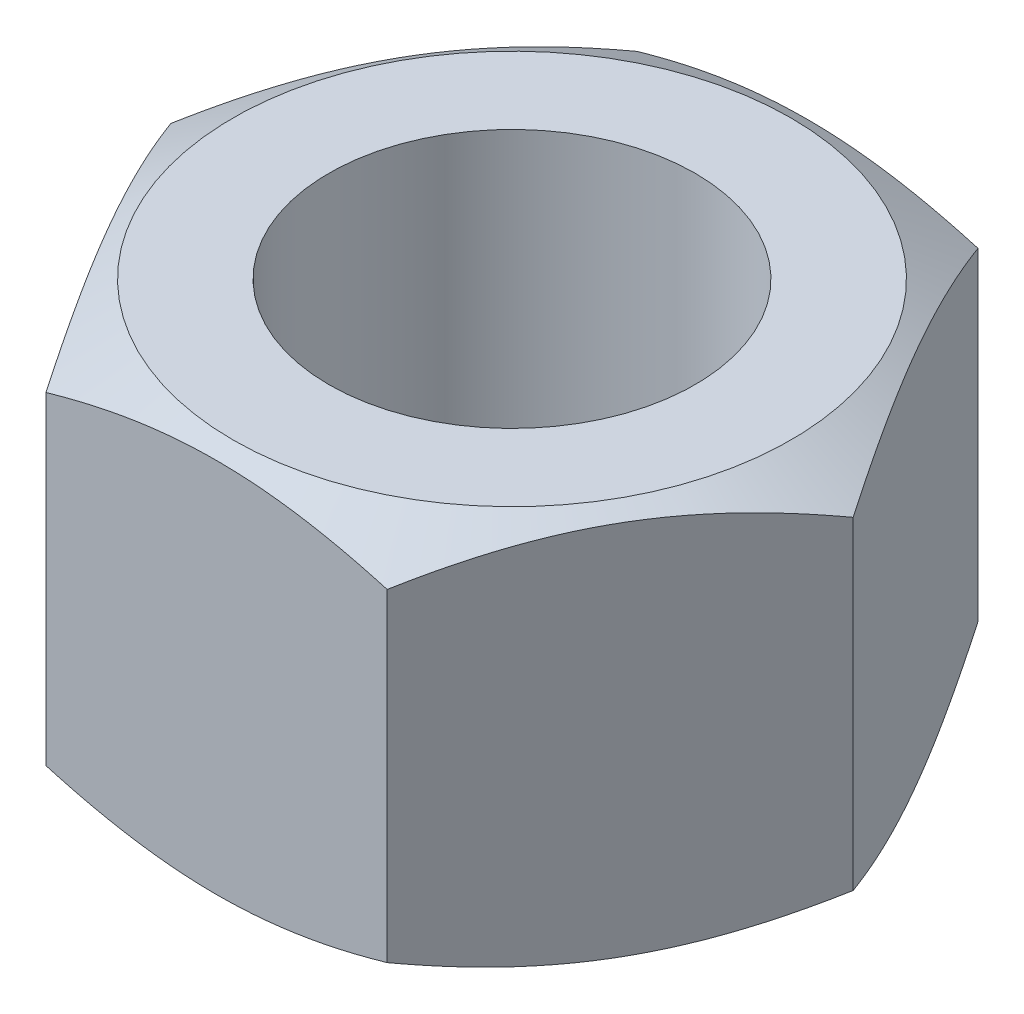
ISO-10303-21;
HEADER;
FILE_DESCRIPTION(('STEP AP214'),'2;1');
FILE_NAME('part.step','',(''),(''),'','','');
FILE_SCHEMA(('AUTOMOTIVE_DESIGN { 1 0 10303 214 1 1 1 1 }'));
ENDSEC;
DATA;
#1=APPLICATION_CONTEXT('core data for automotive mechanical design processes');
#2=APPLICATION_PROTOCOL_DEFINITION('international standard','automotive_design',2000,#1);
#3=PRODUCT_CONTEXT('',#1,'mechanical');
#4=PRODUCT('Part','Part','',(#3));
#5=PRODUCT_RELATED_PRODUCT_CATEGORY('part','',(#4));
#6=PRODUCT_DEFINITION_FORMATION('','',#4);
#7=PRODUCT_DEFINITION_CONTEXT('part definition',#1,'design');
#8=PRODUCT_DEFINITION('design','',#6,#7);
#9=PRODUCT_DEFINITION_SHAPE('','',#8);
#10=(LENGTH_UNIT() NAMED_UNIT(*) SI_UNIT(.MILLI.,.METRE.));
#11=(NAMED_UNIT(*) PLANE_ANGLE_UNIT() SI_UNIT($,.RADIAN.));
#12=(NAMED_UNIT(*) SI_UNIT($,.STERADIAN.) SOLID_ANGLE_UNIT());
#13=UNCERTAINTY_MEASURE_WITH_UNIT(LENGTH_MEASURE(1.E-05),#10,'distance_accuracy_value','');
#14=(GEOMETRIC_REPRESENTATION_CONTEXT(3) GLOBAL_UNCERTAINTY_ASSIGNED_CONTEXT((#13)) GLOBAL_UNIT_ASSIGNED_CONTEXT((#10,
#11,#12)) REPRESENTATION_CONTEXT('',''));
#15=CARTESIAN_POINT('',(0.,0.,0.));
#16=DIRECTION('',(0.,0.,1.));
#17=DIRECTION('',(1.,0.,0.));
#18=AXIS2_PLACEMENT_3D('',#15,#16,#17);
#19=CARTESIAN_POINT('',(4.75000000000009,11.,8.22724133595211));
#20=DIRECTION('',(-0.866025403784441,0.,-0.499999999999995));
#21=DIRECTION('',(-0.499999999999995,0.,0.866025403784441));
#22=AXIS2_PLACEMENT_3D('',#19,#20,#21);
#23=PLANE('',#22);
#24=CARTESIAN_POINT('',(9.50011547005384,1.00006666788213,-0.0002));
#25=CARTESIAN_POINT('',(9.39570528224224,0.939794867126232,0.180643750117506));
#26=CARTESIAN_POINT('',(9.29090581630421,0.882258441601464,0.362161749728252));
#27=CARTESIAN_POINT('',(9.08045577541888,0.773409738616173,0.726671912996599));
#28=CARTESIAN_POINT('',(8.97480485391888,0.722100147792285,0.909664676901065));
#29=CARTESIAN_POINT('',(8.65616049446447,0.578518859269025,1.46157289702136));
#30=CARTESIAN_POINT('',(8.44190922604676,0.496851710273093,1.83266697950692));
#31=CARTESIAN_POINT('',(8.12128634412904,0.401087374782487,2.38800210105756));
#32=CARTESIAN_POINT('',(8.01587257987075,0.373806890421839,2.57058409657002));
#33=CARTESIAN_POINT('',(7.80456834042282,0.328062154900066,2.93657377514854));
#34=CARTESIAN_POINT('',(7.69867790818763,0.309597124785051,3.11998138381532));
#35=CARTESIAN_POINT('',(7.48671471806795,0.281951265466873,3.48711239843698));
#36=CARTESIAN_POINT('',(7.3806423045621,0.272759900012447,3.67083520791058));
#37=CARTESIAN_POINT('',(7.16839949050621,0.263858422441347,4.03845054539677));
#38=CARTESIAN_POINT('',(7.0622290930848,0.26414801740481,4.22234306799045));
#39=CARTESIAN_POINT('',(6.86373975196241,0.273549004302189,4.5661366915753));
#40=CARTESIAN_POINT('',(6.77140680113468,0.281513604791298,4.72606205362168));
#41=CARTESIAN_POINT('',(6.58695715318213,0.304458930439735,5.0455382153137));
#42=CARTESIAN_POINT('',(6.49484047105562,0.319440128553309,5.20508898898149));
#43=CARTESIAN_POINT('',(6.21884704544514,0.374554502365562,5.68312362469382));
#44=CARTESIAN_POINT('',(6.03545883355347,0.424851574920636,6.0007613251994));
#45=CARTESIAN_POINT('',(5.66673706150047,0.55059509206533,6.63940616825205));
#46=CARTESIAN_POINT('',(5.48145055971094,0.626574561251099,6.96033180330822));
#47=CARTESIAN_POINT('',(5.11364066600817,0.799016546625868,7.59739722672793));
#48=CARTESIAN_POINT('',(4.93111256395288,0.895438560442292,7.91354517329681));
#49=CARTESIAN_POINT('',(4.74988452994626,1.00006666788213,8.22744133595211));
#50=B_SPLINE_CURVE_WITH_KNOTS('',3,(#24,#25,#26,#27,#28,#29,#30,#31,#32,#33,#34,#35,#36,#37,#38,
#39,#40,#41,#42,#43,#44,#45,#46,#47,#48,#49),.UNSPECIFIED.,.F.,.F.,(4,2,2,2,2,2,2,2,2,2,2,2,4),
(0.,0.651981443680322,1.30424319931677,2.61147679303848,3.24908400419042,3.88663486446454,
4.52346055445684,5.16026656936256,5.71464112370343,6.26905305107828,7.37866663979234,
8.51288929322073,9.64488539256853),.UNSPECIFIED.);
#51=CARTESIAN_POINT('',(9.5,1.,0.));
#52=VERTEX_POINT('',#51);
#53=CARTESIAN_POINT('',(4.75000000000009,1.,8.22724133595211));
#54=VERTEX_POINT('',#53);
#55=EDGE_CURVE('E63',#52,#54,#50,.T.);
#56=ORIENTED_EDGE('',*,*,#55,.F.);
#57=DIRECTION('',(0.,-1.,0.));
#58=VECTOR('',#57,1.);
#59=CARTESIAN_POINT('',(9.5,11.,0.));
#60=LINE('',#59,#58);
#61=CARTESIAN_POINT('',(9.5,10.,0.));
#62=VERTEX_POINT('',#61);
#63=EDGE_CURVE('E11',#62,#52,#60,.T.);
#64=ORIENTED_EDGE('',*,*,#63,.F.);
#65=CARTESIAN_POINT('',(4.74988452994626,9.99993333211787,8.22744133595211));
#66=CARTESIAN_POINT('',(4.85429471775786,10.0602051328738,8.0465975858346));
#67=CARTESIAN_POINT('',(4.95909418369588,10.1177415583985,7.86507958622386));
#68=CARTESIAN_POINT('',(5.16954422458122,10.2265902613838,7.50056942295551));
#69=CARTESIAN_POINT('',(5.27519514608121,10.2778998522077,7.31757665905104));
#70=CARTESIAN_POINT('',(5.59383950553562,10.421481140731,6.76566843893076));
#71=CARTESIAN_POINT('',(5.80809077395334,10.5031482897269,6.39457435644519));
#72=CARTESIAN_POINT('',(6.12871365587105,10.5989126252175,5.83923923489455));
#73=CARTESIAN_POINT('',(6.23412742012935,10.6261931095782,5.65665723938209));
#74=CARTESIAN_POINT('',(6.44543165957728,10.6719378450999,5.29066756080357));
#75=CARTESIAN_POINT('',(6.55132209181247,10.6904028752149,5.10725995213679));
#76=CARTESIAN_POINT('',(6.76328528193214,10.7180487345331,4.74012893751513));
#77=CARTESIAN_POINT('',(6.869357695438,10.7272400999876,4.55640612804153));
#78=CARTESIAN_POINT('',(7.08160050949388,10.7361415775587,4.18879079055534));
#79=CARTESIAN_POINT('',(7.1877709069153,10.7358519825952,4.00489826796167));
#80=CARTESIAN_POINT('',(7.38626024803769,10.7264509956978,3.66110464437681));
#81=CARTESIAN_POINT('',(7.47859319886541,10.7184863952087,3.50117928233043));
#82=CARTESIAN_POINT('',(7.66304284681796,10.6955410695603,3.18170312063841));
#83=CARTESIAN_POINT('',(7.75515952894447,10.6805598714467,3.02215234697063));
#84=CARTESIAN_POINT('',(8.03115295455495,10.6254454976344,2.54411771125829));
#85=CARTESIAN_POINT('',(8.21454116644662,10.5751484250794,2.22648001075271));
#86=CARTESIAN_POINT('',(8.58326293849962,10.4494049079347,1.58783516770006));
#87=CARTESIAN_POINT('',(8.76854944028916,10.3734254387489,1.26690953264389));
#88=CARTESIAN_POINT('',(9.13635933399192,10.2009834533741,0.629844109224181));
#89=CARTESIAN_POINT('',(9.31888743604721,10.1045614395577,0.313696162655302));
#90=CARTESIAN_POINT('',(9.50011547005384,9.99993333211787,-0.000200000000000225));
#91=B_SPLINE_CURVE_WITH_KNOTS('',3,(#65,#66,#67,#68,#69,#70,#71,#72,#73,#74,#75,#76,#77,#78,#79,
#80,#81,#82,#83,#84,#85,#86,#87,#88,#89,#90),.UNSPECIFIED.,.F.,.F.,(4,2,2,2,2,2,2,2,2,2,2,2,4),
(0.,0.651981443680323,1.30424319931677,2.61147679303848,3.24908400419042,3.88663486446454,
4.52346055445684,5.16026656936256,5.71464112370343,6.26905305107828,7.37866663979233,
8.51288929322073,9.64488539256853),.UNSPECIFIED.);
#92=CARTESIAN_POINT('',(4.75000000000009,10.,8.22724133595211));
#93=VERTEX_POINT('',#92);
#94=EDGE_CURVE('E146',#93,#62,#91,.T.);
#95=ORIENTED_EDGE('',*,*,#94,.F.);
#96=DIRECTION('',(0.,-1.,0.));
#97=VECTOR('',#96,1.);
#98=CARTESIAN_POINT('',(4.75000000000009,11.,8.22724133595211));
#99=LINE('',#98,#97);
#100=EDGE_CURVE('E134',#93,#54,#99,.T.);
#101=ORIENTED_EDGE('',*,*,#100,.T.);
#102=EDGE_LOOP('',(#56,#64,#95,#101));
#103=FACE_BOUND('',#102,.T.);
#104=ADVANCED_FACE('F47',(#103),#23,.F.);
#105=CARTESIAN_POINT('',(9.5,11.,0.));
#106=DIRECTION('',(-0.866025403784438,0.,0.500000000000001));
#107=DIRECTION('',(0.500000000000001,0.,0.866025403784438));
#108=AXIS2_PLACEMENT_3D('',#105,#106,#107);
#109=PLANE('',#108);
#110=CARTESIAN_POINT('',(4.74988452994614,1.00006666788213,-8.22744133595218));
#111=CARTESIAN_POINT('',(4.85429471775774,0.939794867126229,-8.04659758583467));
#112=CARTESIAN_POINT('',(4.95909418369577,0.882258441601461,-7.86507958622393));
#113=CARTESIAN_POINT('',(5.1695442245811,0.77340973861617,-7.50056942295558));
#114=CARTESIAN_POINT('',(5.2751951460811,0.722100147792281,-7.31757665905112));
#115=CARTESIAN_POINT('',(5.59383950553552,0.578518859269018,-6.76566843893083));
#116=CARTESIAN_POINT('',(5.80809077395323,0.496851710273084,-6.39457435644527));
#117=CARTESIAN_POINT('',(6.12871365587095,0.401087374782475,-5.83923923489462));
#118=CARTESIAN_POINT('',(6.23412742012925,0.373806890421827,-5.65665723938217));
#119=CARTESIAN_POINT('',(6.44543165957718,0.328062154900053,-5.29066756080365));
#120=CARTESIAN_POINT('',(6.55132209181237,0.309597124785037,-5.10725995213687));
#121=CARTESIAN_POINT('',(6.76328528193205,0.281951265466857,-4.74012893751521));
#122=CARTESIAN_POINT('',(6.86935769543791,0.272759900012431,-4.55640612804162));
#123=CARTESIAN_POINT('',(7.08160050949379,0.263858422441329,-4.18879079055542));
#124=CARTESIAN_POINT('',(7.18777090691521,0.26414801740479,-4.00489826796175));
#125=CARTESIAN_POINT('',(7.3862602480376,0.273549004302167,-3.66110464437689));
#126=CARTESIAN_POINT('',(7.47859319886533,0.281513604791276,-3.50117928233051));
#127=CARTESIAN_POINT('',(7.66304284681789,0.304458930439714,-3.18170312063848));
#128=CARTESIAN_POINT('',(7.7551595289444,0.319440128553288,-3.0221523469707));
#129=CARTESIAN_POINT('',(8.03115295455489,0.374554502365542,-2.54411771125835));
#130=CARTESIAN_POINT('',(8.21454116644657,0.424851574920616,-2.22648001075276));
#131=CARTESIAN_POINT('',(8.58326293849959,0.550595092065313,-1.5878351677001));
#132=CARTESIAN_POINT('',(8.76854944028913,0.626574561251085,-1.26690953264392));
#133=CARTESIAN_POINT('',(9.13635933399191,0.799016546625861,-0.629844109224196));
#134=CARTESIAN_POINT('',(9.3188874360472,0.895438560442289,-0.313696162655309));
#135=CARTESIAN_POINT('',(9.50011547005384,1.00006666788213,0.000200000000000236));
#136=B_SPLINE_CURVE_WITH_KNOTS('',3,(#110,#111,#112,#113,#114,#115,#116,#117,#118,#119,#120,
#121,#122,#123,#124,#125,#126,#127,#128,#129,#130,#131,#132,#133,#134,#135),.UNSPECIFIED.,.F.,
.F.,(4,2,2,2,2,2,2,2,2,2,2,2,4),(0.,0.651981443680322,1.30424319931677,2.61147679303848,
3.24908400419042,3.88663486446454,4.52346055445684,5.16026656936256,5.71464112370345,
6.26905305107831,7.37866663979239,8.51288929322082,9.64488539256865),.UNSPECIFIED.);
#137=CARTESIAN_POINT('',(4.74999999999998,1.,-8.22724133595218));
#138=VERTEX_POINT('',#137);
#139=EDGE_CURVE('E102',#138,#52,#136,.T.);
#140=ORIENTED_EDGE('',*,*,#139,.F.);
#141=DIRECTION('',(0.,-1.,0.));
#142=VECTOR('',#141,1.);
#143=CARTESIAN_POINT('',(4.74999999999998,11.,-8.22724133595218));
#144=LINE('',#143,#142);
#145=CARTESIAN_POINT('',(4.74999999999998,10.,-8.22724133595218));
#146=VERTEX_POINT('',#145);
#147=EDGE_CURVE('E56',#146,#138,#144,.T.);
#148=ORIENTED_EDGE('',*,*,#147,.F.);
#149=CARTESIAN_POINT('',(9.50011547005384,9.99993333211787,0.000200000000000216));
#150=CARTESIAN_POINT('',(9.39570528224224,10.0602051328738,-0.180643750117505));
#151=CARTESIAN_POINT('',(9.29090581630421,10.1177415583985,-0.36216174972825));
#152=CARTESIAN_POINT('',(9.08045577541887,10.2265902613838,-0.726671912996595));
#153=CARTESIAN_POINT('',(8.97480485391888,10.2778998522077,-0.909664676901061));
#154=CARTESIAN_POINT('',(8.65616049446446,10.421481140731,-1.46157289702135));
#155=CARTESIAN_POINT('',(8.44190922604674,10.5031482897269,-1.83266697950691));
#156=CARTESIAN_POINT('',(8.12128634412903,10.5989126252175,-2.38800210105755));
#157=CARTESIAN_POINT('',(8.01587257987073,10.6261931095782,-2.57058409657001));
#158=CARTESIAN_POINT('',(7.8045683404228,10.6719378450999,-2.93657377514852));
#159=CARTESIAN_POINT('',(7.69867790818761,10.690402875215,-3.1199813838153));
#160=CARTESIAN_POINT('',(7.48671471806793,10.7180487345331,-3.48711239843696));
#161=CARTESIAN_POINT('',(7.38064230456207,10.7272400999876,-3.67083520791056));
#162=CARTESIAN_POINT('',(7.16839949050619,10.7361415775587,-4.03845054539675));
#163=CARTESIAN_POINT('',(7.06222909308477,10.7358519825952,-4.22234306799043));
#164=CARTESIAN_POINT('',(6.86373975196237,10.7264509956978,-4.56613669157529));
#165=CARTESIAN_POINT('',(6.77140680113465,10.7184863952087,-4.72606205362167));
#166=CARTESIAN_POINT('',(6.58695715318209,10.6955410695603,-5.04553821531369));
#167=CARTESIAN_POINT('',(6.49484047105557,10.6805598714467,-5.20508898898148));
#168=CARTESIAN_POINT('',(6.21884704544508,10.6254454976345,-5.68312362469383));
#169=CARTESIAN_POINT('',(6.03545883355341,10.5751484250794,-6.00076132519942));
#170=CARTESIAN_POINT('',(5.66673706150039,10.4494049079347,-6.63940616825208));
#171=CARTESIAN_POINT('',(5.48145055971085,10.3734254387489,-6.96033180330826));
#172=CARTESIAN_POINT('',(5.11364066600807,10.2009834533741,-7.59739722672798));
#173=CARTESIAN_POINT('',(4.93111256395277,10.1045614395577,-7.91354517329687));
#174=CARTESIAN_POINT('',(4.74988452994614,9.99993333211787,-8.22744133595218));
#175=B_SPLINE_CURVE_WITH_KNOTS('',3,(#149,#150,#151,#152,#153,#154,#155,#156,#157,#158,#159,
#160,#161,#162,#163,#164,#165,#166,#167,#168,#169,#170,#171,#172,#173,#174),.UNSPECIFIED.,.F.,
.F.,(4,2,2,2,2,2,2,2,2,2,2,2,4),(0.,0.651981443680322,1.30424319931677,2.61147679303848,
3.24908400419042,3.88663486446454,4.52346055445684,5.16026656936256,5.71464112370345,
6.26905305107831,7.37866663979239,8.51288929322082,9.64488539256865),.UNSPECIFIED.);
#176=EDGE_CURVE('E154',#62,#146,#175,.T.);
#177=ORIENTED_EDGE('',*,*,#176,.F.);
#178=ORIENTED_EDGE('',*,*,#63,.T.);
#179=EDGE_LOOP('',(#140,#148,#177,#178));
#180=FACE_BOUND('',#179,.T.);
#181=ADVANCED_FACE('F113',(#180),#109,.F.);
#182=CARTESIAN_POINT('',(4.74999999999998,11.,-8.22724133595218));
#183=DIRECTION('',(0.,0.,1.));
#184=DIRECTION('',(1.,0.,0.));
#185=AXIS2_PLACEMENT_3D('',#182,#183,#184);
#186=PLANE('',#185);
#187=CARTESIAN_POINT('',(-14.3026865872715,5.04152787755601,-8.22724133595211));
#188=CARTESIAN_POINT('',(-13.9604976931376,4.87030264043127,-8.22724133595212));
#189=CARTESIAN_POINT('',(-13.6177129405169,4.70025573525876,-8.22724133595212));
#190=CARTESIAN_POINT('',(-12.9306799710009,4.36308821777654,-8.22724133595212));
#191=CARTESIAN_POINT('',(-12.5864316582444,4.19596780093509,-8.22724133595212));
#192=CARTESIAN_POINT('',(-11.8955515233445,3.86491339115043,-8.22724133595212));
#193=CARTESIAN_POINT('',(-11.5489163007604,3.70098647958629,-8.22724133595212));
#194=CARTESIAN_POINT('',(-10.8536379270428,3.37745731636788,-8.22724133595213));
#195=CARTESIAN_POINT('',(-10.5049948152816,3.21785498026152,-8.22724133595213));
#196=CARTESIAN_POINT('',(-9.78954662997645,2.89690029821054,-8.22724133595213));
#197=CARTESIAN_POINT('',(-9.42263115562871,2.73579324065292,-8.22724133595213));
#198=CARTESIAN_POINT('',(-8.68564741614397,2.42088347376006,-8.22724133595213));
#199=CARTESIAN_POINT('',(-8.31557901113428,2.26708109049122,-8.22724133595213));
#200=CARTESIAN_POINT('',(-7.57192665848544,1.96885398035987,-8.22724133595213));
#201=CARTESIAN_POINT('',(-7.19834503496867,1.82442349331383,-8.22724133595213));
#202=CARTESIAN_POINT('',(-6.44681816079827,1.54745666424325,-8.22724133595214));
#203=CARTESIAN_POINT('',(-6.06887339276517,1.41491902067692,-8.22724133595214));
#204=CARTESIAN_POINT('',(-5.21908205499906,1.1358784919845,-8.22724133595214));
#205=CARTESIAN_POINT('',(-4.74591380146708,0.993339805791136,-8.22724133595214));
#206=CARTESIAN_POINT('',(-3.79104071185597,0.739490651554016,-8.22724133595215));
#207=CARTESIAN_POINT('',(-3.30933662574505,0.628177454324328,-8.22724133595215));
#208=CARTESIAN_POINT('',(-2.58519355474127,0.492444777691878,-8.22724133595215));
#209=CARTESIAN_POINT('',(-2.34561612769758,0.452619465823836,-8.22724133595215));
#210=CARTESIAN_POINT('',(-1.86489071030489,0.383818216594571,-8.22724133595215));
#211=CARTESIAN_POINT('',(-1.62374274740445,0.354842090134989,-8.22724133595215));
#212=CARTESIAN_POINT('',(-1.14040299374796,0.308614124345125,-8.22724133595216));
#213=CARTESIAN_POINT('',(-0.898211603073655,0.291358134904983,-8.22724133595216));
#214=CARTESIAN_POINT('',(-0.413260924226474,0.269113720435627,-8.22724133595216));
#215=CARTESIAN_POINT('',(-0.170501638525682,0.264125242104239,-8.22724133595216));
#216=CARTESIAN_POINT('',(0.316430862435099,0.266593200216862,-8.22724133595216));
#217=CARTESIAN_POINT('',(0.560603692493146,0.274125550792473,-8.22724133595216));
#218=CARTESIAN_POINT('',(1.04824946998837,0.301521992601177,-8.22724133595217));
#219=CARTESIAN_POINT('',(1.29172241431225,0.32138613860469,-8.22724133595217));
#220=CARTESIAN_POINT('',(1.77751383206231,0.372812551672586,-8.22724133595217));
#221=CARTESIAN_POINT('',(2.01983183341398,0.404379245609077,-8.22724133595217));
#222=CARTESIAN_POINT('',(2.50280334073167,0.478278886201028,-8.22724133595217));
#223=CARTESIAN_POINT('',(2.74345678818226,0.520612209388605,-8.22724133595217));
#224=CARTESIAN_POINT('',(3.47066701254368,0.663731016978516,-8.22724133595217));
#225=CARTESIAN_POINT('',(3.95427777357201,0.779705047821516,-8.22724133595217));
#226=CARTESIAN_POINT('',(4.67326469934219,0.976622690641671,-8.22724133595218));
#227=CARTESIAN_POINT('',(4.91193576747811,1.04611562306419,-8.22724133595218));
#228=CARTESIAN_POINT('',(5.38725533256936,1.19171689802714,-8.22724133595218));
#229=CARTESIAN_POINT('',(5.62390390579201,1.26782498989334,-8.22724133595218));
#230=CARTESIAN_POINT('',(6.23197428928129,1.47148143340854,-8.22724133595218));
#231=CARTESIAN_POINT('',(6.6019725425254,1.60326673600757,-8.22724133595218));
#232=CARTESIAN_POINT('',(7.33770837070854,1.87784390791077,-8.22724133595218));
#233=CARTESIAN_POINT('',(7.70344708918052,2.02063274091376,-8.22724133595218));
#234=CARTESIAN_POINT('',(8.43164610258645,2.31498969764609,-8.22724133595219));
#235=CARTESIAN_POINT('',(8.79410401359354,2.4665636922419,-8.22724133595219));
#236=CARTESIAN_POINT('',(9.516076151004,2.77660049667046,-8.22724133595219));
#237=CARTESIAN_POINT('',(9.87559019351708,2.93506373300078,-8.22724133595219));
#238=CARTESIAN_POINT('',(10.5769291004224,3.25064821077868,-8.2272413359522));
#239=CARTESIAN_POINT('',(10.9188570976916,3.40754093715873,-8.2272413359522));
#240=CARTESIAN_POINT('',(11.6007868947646,3.72543691663015,-8.2272413359522));
#241=CARTESIAN_POINT('',(11.9407887244099,3.88644010582526,-8.2272413359522));
#242=CARTESIAN_POINT('',(12.6185628086518,4.21153249875392,-8.2272413359522));
#243=CARTESIAN_POINT('',(12.956337963042,4.37561566896288,-8.2272413359522));
#244=CARTESIAN_POINT('',(13.6304957341984,4.70659639608306,-8.22724133595221));
#245=CARTESIAN_POINT('',(13.9668783897223,4.87349387399829,-8.22724133595221));
#246=CARTESIAN_POINT('',(14.3026865872714,5.04152787755601,-8.22724133595221));
#247=B_SPLINE_CURVE_WITH_KNOTS('',3,(#187,#188,#189,#190,#191,#192,#193,#194,#195,#196,#197,
#198,#199,#200,#201,#202,#203,#204,#205,#206,#207,#208,#209,#210,#211,#212,#213,#214,#215,#216,
#217,#218,#219,#220,#221,#222,#223,#224,#225,#226,#227,#228,#229,#230,#231,#232,#233,#234,#235,
#236,#237,#238,#239,#240,#241,#242,#243,#244,#245,#246),.UNSPECIFIED.,.F.,.F.,(4,2,2,2,2,2,2,2,
2,2,2,2,2,2,2,2,2,2,2,2,2,2,2,2,2,2,2,2,2,4),(0.,1.14791801251633,2.29591240742907,
3.44621471257658,4.59649453793554,5.79861386316431,7.00078679831877,8.20221371126443,
9.40350898039037,10.8852774260959,12.3669163211477,13.0953041341597,13.8236792509786,
14.5517963149328,15.2799102152224,16.0124548117764,16.7450026618763,17.4778279054281,
18.2106787809753,19.7010469951653,20.4467398787903,21.1924045175079,22.3704663400705,
23.5482042457074,24.7267384828175,25.9053457845343,27.0339278627579,28.1624924080821,
29.2890387679748,30.4155535588331),.UNSPECIFIED.);
#248=CARTESIAN_POINT('',(-4.75000000000004,1.,-8.22724133595214));
#249=VERTEX_POINT('',#248);
#250=EDGE_CURVE('E99',#249,#138,#247,.T.);
#251=ORIENTED_EDGE('',*,*,#250,.F.);
#252=DIRECTION('',(0.,-1.,0.));
#253=VECTOR('',#252,1.);
#254=CARTESIAN_POINT('',(-4.75000000000004,11.,-8.22724133595214));
#255=LINE('',#254,#253);
#256=CARTESIAN_POINT('',(-4.75000000000004,10.,-8.22724133595214));
#257=VERTEX_POINT('',#256);
#258=EDGE_CURVE('E122',#257,#249,#255,.T.);
#259=ORIENTED_EDGE('',*,*,#258,.F.);
#260=CARTESIAN_POINT('',(14.3026865872714,5.95847212244399,-8.22724133595221));
#261=CARTESIAN_POINT('',(13.9604976931376,6.12969735956873,-8.22724133595221));
#262=CARTESIAN_POINT('',(13.6177129405169,6.29974426474124,-8.22724133595221));
#263=CARTESIAN_POINT('',(12.9306799710008,6.63691178222346,-8.2272413359522));
#264=CARTESIAN_POINT('',(12.5864316582443,6.80403219906491,-8.2272413359522));
#265=CARTESIAN_POINT('',(11.8955515233444,7.13508660884958,-8.2272413359522));
#266=CARTESIAN_POINT('',(11.5489163007604,7.29901352041371,-8.2272413359522));
#267=CARTESIAN_POINT('',(10.8536379270428,7.62254268363212,-8.2272413359522));
#268=CARTESIAN_POINT('',(10.5049948152815,7.78214501973848,-8.2272413359522));
#269=CARTESIAN_POINT('',(9.78954662997639,8.10309970178947,-8.22724133595219));
#270=CARTESIAN_POINT('',(9.42263115562865,8.26420675934708,-8.22724133595219));
#271=CARTESIAN_POINT('',(8.68564741614391,8.57911652623994,-8.22724133595219));
#272=CARTESIAN_POINT('',(8.31557901113422,8.73291890950878,-8.22724133595219));
#273=CARTESIAN_POINT('',(7.57192665848538,9.03114601964013,-8.22724133595218));
#274=CARTESIAN_POINT('',(7.19834503496862,9.17557650668617,-8.22724133595218));
#275=CARTESIAN_POINT('',(6.44681816079821,9.45254333575675,-8.22724133595218));
#276=CARTESIAN_POINT('',(6.06887339276512,9.58508097932308,-8.22724133595218));
#277=CARTESIAN_POINT('',(5.219082054999,9.8641215080155,-8.22724133595218));
#278=CARTESIAN_POINT('',(4.74591380146702,10.0066601942089,-8.22724133595218));
#279=CARTESIAN_POINT('',(3.79104071185591,10.260509348446,-8.22724133595217));
#280=CARTESIAN_POINT('',(3.309336625745,10.3718225456757,-8.22724133595217));
#281=CARTESIAN_POINT('',(2.58519355474122,10.5075552223081,-8.22724133595217));
#282=CARTESIAN_POINT('',(2.34561612769753,10.5473805341762,-8.22724133595217));
#283=CARTESIAN_POINT('',(1.86489071030483,10.6161817834054,-8.22724133595217));
#284=CARTESIAN_POINT('',(1.62374274740439,10.645157909865,-8.22724133595217));
#285=CARTESIAN_POINT('',(1.14040299374791,10.6913858756549,-8.22724133595216));
#286=CARTESIAN_POINT('',(0.898211603073601,10.708641865095,-8.22724133595216));
#287=CARTESIAN_POINT('',(0.413260924226418,10.7308862795644,-8.22724133595216));
#288=CARTESIAN_POINT('',(0.170501638525627,10.7358747578958,-8.22724133595216));
#289=CARTESIAN_POINT('',(-0.316430862435154,10.7334067997831,-8.22724133595216));
#290=CARTESIAN_POINT('',(-0.560603692493201,10.7258744492075,-8.22724133595216));
#291=CARTESIAN_POINT('',(-1.04824946998842,10.6984780073988,-8.22724133595215));
#292=CARTESIAN_POINT('',(-1.2917224143123,10.6786138613953,-8.22724133595215));
#293=CARTESIAN_POINT('',(-1.77751383206236,10.6271874483274,-8.22724133595215));
#294=CARTESIAN_POINT('',(-2.01983183341403,10.5956207543909,-8.22724133595215));
#295=CARTESIAN_POINT('',(-2.50280334073172,10.521721113799,-8.22724133595215));
#296=CARTESIAN_POINT('',(-2.74345678818231,10.4793877906114,-8.22724133595215));
#297=CARTESIAN_POINT('',(-3.47066701254373,10.3362689830215,-8.22724133595215));
#298=CARTESIAN_POINT('',(-3.95427777357206,10.2202949521785,-8.22724133595215));
#299=CARTESIAN_POINT('',(-4.67326469934225,10.0233773093583,-8.22724133595214));
#300=CARTESIAN_POINT('',(-4.91193576747817,9.95388437693581,-8.22724133595214));
#301=CARTESIAN_POINT('',(-5.38725533256942,9.80828310197286,-8.22724133595214));
#302=CARTESIAN_POINT('',(-5.62390390579207,9.73217501010666,-8.22724133595214));
#303=CARTESIAN_POINT('',(-6.23197428928135,9.52851856659146,-8.22724133595214));
#304=CARTESIAN_POINT('',(-6.60197254252546,9.39673326399243,-8.22724133595214));
#305=CARTESIAN_POINT('',(-7.33770837070859,9.12215609208923,-8.22724133595213));
#306=CARTESIAN_POINT('',(-7.70344708918057,8.97936725908624,-8.22724133595213));
#307=CARTESIAN_POINT('',(-8.4316461025865,8.68501030235391,-8.22724133595213));
#308=CARTESIAN_POINT('',(-8.79410401359359,8.5334363077581,-8.22724133595213));
#309=CARTESIAN_POINT('',(-9.51607615100405,8.22339950332954,-8.22724133595213));
#310=CARTESIAN_POINT('',(-9.87559019351713,8.06493626699922,-8.22724133595213));
#311=CARTESIAN_POINT('',(-10.5769291004225,7.74935178922132,-8.22724133595213));
#312=CARTESIAN_POINT('',(-10.9188570976917,7.59245906284127,-8.22724133595213));
#313=CARTESIAN_POINT('',(-11.6007868947646,7.27456308336985,-8.22724133595212));
#314=CARTESIAN_POINT('',(-11.9407887244099,7.11355989417474,-8.22724133595212));
#315=CARTESIAN_POINT('',(-12.6185628086518,6.78846750124608,-8.22724133595212));
#316=CARTESIAN_POINT('',(-12.956337963042,6.62438433103711,-8.22724133595212));
#317=CARTESIAN_POINT('',(-13.6304957341985,6.29340360391694,-8.22724133595212));
#318=CARTESIAN_POINT('',(-13.9668783897223,6.12650612600171,-8.22724133595212));
#319=CARTESIAN_POINT('',(-14.3026865872715,5.95847212244399,-8.22724133595211));
#320=B_SPLINE_CURVE_WITH_KNOTS('',3,(#260,#261,#262,#263,#264,#265,#266,#267,#268,#269,#270,
#271,#272,#273,#274,#275,#276,#277,#278,#279,#280,#281,#282,#283,#284,#285,#286,#287,#288,#289,
#290,#291,#292,#293,#294,#295,#296,#297,#298,#299,#300,#301,#302,#303,#304,#305,#306,#307,#308,
#309,#310,#311,#312,#313,#314,#315,#316,#317,#318,#319),.UNSPECIFIED.,.F.,.F.,(4,2,2,2,2,2,2,2,
2,2,2,2,2,2,2,2,2,2,2,2,2,2,2,2,2,2,2,2,2,4),(0.,1.14791801251634,2.29591240742907,
3.44621471257659,4.59649453793554,5.79861386316431,7.00078679831877,8.20221371126443,
9.40350898039037,10.8852774260959,12.3669163211477,13.0953041341597,13.8236792509786,
14.5517963149328,15.2799102152224,16.0124548117764,16.7450026618763,17.4778279054281,
18.2106787809753,19.7010469951653,20.4467398787903,21.1924045175079,22.3704663400705,
23.5482042457074,24.7267384828175,25.9053457845343,27.0339278627579,28.1624924080821,
29.2890387679748,30.4155535588331),.UNSPECIFIED.);
#321=EDGE_CURVE('E120',#146,#257,#320,.T.);
#322=ORIENTED_EDGE('',*,*,#321,.F.);
#323=ORIENTED_EDGE('',*,*,#147,.T.);
#324=EDGE_LOOP('',(#251,#259,#322,#323));
#325=FACE_BOUND('',#324,.T.);
#326=ADVANCED_FACE('F119',(#325),#186,.F.);
#327=CARTESIAN_POINT('',(-4.75000000000004,11.,-8.22724133595214));
#328=DIRECTION('',(0.866025403784442,0.,0.499999999999995));
#329=DIRECTION('',(0.499999999999995,0.,-0.866025403784441));
#330=AXIS2_PLACEMENT_3D('',#327,#328,#329);
#331=PLANE('',#330);
#332=CARTESIAN_POINT('',(-9.50011547005384,1.00006666788213,0.000200000000066338));
#333=CARTESIAN_POINT('',(-9.39570528224223,0.939794867126229,-0.180643750117439));
#334=CARTESIAN_POINT('',(-9.29090581630421,0.882258441601461,-0.362161749728185));
#335=CARTESIAN_POINT('',(-9.08045577541888,0.773409738616169,-0.726671912996531));
#336=CARTESIAN_POINT('',(-8.97480485391888,0.72210014779228,-0.909664676900998));
#337=CARTESIAN_POINT('',(-8.65616049446447,0.578518859269018,-1.46157289702129));
#338=CARTESIAN_POINT('',(-8.44190922604676,0.496851710273084,-1.83266697950685));
#339=CARTESIAN_POINT('',(-8.12128634412904,0.401087374782475,-2.3880021010575));
#340=CARTESIAN_POINT('',(-8.01587257987075,0.373806890421827,-2.57058409656995));
#341=CARTESIAN_POINT('',(-7.80456834042282,0.328062154900053,-2.93657377514847));
#342=CARTESIAN_POINT('',(-7.69867790818763,0.309597124785037,-3.11998138381525));
#343=CARTESIAN_POINT('',(-7.48671471806796,0.281951265466857,-3.48711239843691));
#344=CARTESIAN_POINT('',(-7.3806423045621,0.272759900012431,-3.67083520791051));
#345=CARTESIAN_POINT('',(-7.16839949050622,0.263858422441328,-4.0384505453967));
#346=CARTESIAN_POINT('',(-7.0622290930848,0.26414801740479,-4.22234306799038));
#347=CARTESIAN_POINT('',(-6.86373975196241,0.273549004302167,-4.56613669157524));
#348=CARTESIAN_POINT('',(-6.77140680113468,0.281513604791276,-4.72606205362162));
#349=CARTESIAN_POINT('',(-6.58695715318212,0.304458930439714,-5.04553821531365));
#350=CARTESIAN_POINT('',(-6.49484047105561,0.319440128553288,-5.20508898898144));
#351=CARTESIAN_POINT('',(-6.21884704544512,0.374554502365541,-5.68312362469379));
#352=CARTESIAN_POINT('',(-6.03545883355345,0.424851574920616,-6.00076132519938));
#353=CARTESIAN_POINT('',(-5.66673706150044,0.550595092065313,-6.63940616825204));
#354=CARTESIAN_POINT('',(-5.4814505597109,0.626574561251085,-6.96033180330822));
#355=CARTESIAN_POINT('',(-5.11364066600812,0.79901654662586,-7.59739722672794));
#356=CARTESIAN_POINT('',(-4.93111256395283,0.895438560442288,-7.91354517329683));
#357=CARTESIAN_POINT('',(-4.7498845299462,1.00006666788213,-8.22744133595214));
#358=B_SPLINE_CURVE_WITH_KNOTS('',3,(#332,#333,#334,#335,#336,#337,#338,#339,#340,#341,#342,
#343,#344,#345,#346,#347,#348,#349,#350,#351,#352,#353,#354,#355,#356,#357),.UNSPECIFIED.,.F.,
.F.,(4,2,2,2,2,2,2,2,2,2,2,2,4),(0.,0.651981443680321,1.30424319931677,2.61147679303848,
3.24908400419042,3.88663486446454,4.52346055445684,5.16026656936256,5.71464112370345,
6.26905305107831,7.37866663979239,8.51288929322082,9.64488539256865),.UNSPECIFIED.);
#359=CARTESIAN_POINT('',(-9.5,1.,0.));
#360=VERTEX_POINT('',#359);
#361=EDGE_CURVE('E104',#360,#249,#358,.T.);
#362=ORIENTED_EDGE('',*,*,#361,.F.);
#363=DIRECTION('',(0.,-1.,0.));
#364=VECTOR('',#363,1.);
#365=CARTESIAN_POINT('',(-9.5,11.,0.));
#366=LINE('',#365,#364);
#367=CARTESIAN_POINT('',(-9.5,10.,0.));
#368=VERTEX_POINT('',#367);
#369=EDGE_CURVE('E124',#368,#360,#366,.T.);
#370=ORIENTED_EDGE('',*,*,#369,.F.);
#371=CARTESIAN_POINT('',(-4.7498845299462,9.99993333211787,-8.22744133595214));
#372=CARTESIAN_POINT('',(-4.8542947177578,10.0602051328738,-8.04659758583464));
#373=CARTESIAN_POINT('',(-4.95909418369583,10.1177415583985,-7.86507958622389));
#374=CARTESIAN_POINT('',(-5.16954422458116,10.2265902613838,-7.50056942295555));
#375=CARTESIAN_POINT('',(-5.27519514608115,10.2778998522077,-7.31757665905108));
#376=CARTESIAN_POINT('',(-5.59383950553557,10.421481140731,-6.76566843893079));
#377=CARTESIAN_POINT('',(-5.80809077395328,10.5031482897269,-6.39457435644523));
#378=CARTESIAN_POINT('',(-6.12871365587099,10.5989126252175,-5.83923923489458));
#379=CARTESIAN_POINT('',(-6.23412742012929,10.6261931095782,-5.65665723938212));
#380=CARTESIAN_POINT('',(-6.44543165957722,10.6719378450999,-5.29066756080361));
#381=CARTESIAN_POINT('',(-6.55132209181241,10.690402875215,-5.10725995213683));
#382=CARTESIAN_POINT('',(-6.76328528193208,10.7180487345331,-4.74012893751517));
#383=CARTESIAN_POINT('',(-6.86935769543793,10.7272400999876,-4.55640612804157));
#384=CARTESIAN_POINT('',(-7.08160050949382,10.7361415775587,-4.18879079055538));
#385=CARTESIAN_POINT('',(-7.18777090691523,10.7358519825952,-4.0048982679617));
#386=CARTESIAN_POINT('',(-7.38626024803763,10.7264509956978,-3.66110464437684));
#387=CARTESIAN_POINT('',(-7.47859319886535,10.7184863952087,-3.50117928233046));
#388=CARTESIAN_POINT('',(-7.66304284681791,10.6955410695603,-3.18170312063843));
#389=CARTESIAN_POINT('',(-7.75515952894442,10.6805598714467,-3.02215234697064));
#390=CARTESIAN_POINT('',(-8.03115295455491,10.6254454976345,-2.54411771125829));
#391=CARTESIAN_POINT('',(-8.21454116644658,10.5751484250794,-2.2264800107527));
#392=CARTESIAN_POINT('',(-8.5832629384996,10.4494049079347,-1.58783516770004));
#393=CARTESIAN_POINT('',(-8.76854944028914,10.3734254387489,-1.26690953264386));
#394=CARTESIAN_POINT('',(-9.13635933399191,10.2009834533741,-0.629844109224133));
#395=CARTESIAN_POINT('',(-9.31888743604721,10.1045614395577,-0.313696162655245));
#396=CARTESIAN_POINT('',(-9.50011547005384,9.99993333211787,0.0002000000000669));
#397=B_SPLINE_CURVE_WITH_KNOTS('',3,(#371,#372,#373,#374,#375,#376,#377,#378,#379,#380,#381,
#382,#383,#384,#385,#386,#387,#388,#389,#390,#391,#392,#393,#394,#395,#396),.UNSPECIFIED.,.F.,
.F.,(4,2,2,2,2,2,2,2,2,2,2,2,4),(0.,0.651981443680321,1.30424319931677,2.61147679303848,
3.24908400419042,3.88663486446454,4.52346055445683,5.16026656936256,5.71464112370345,
6.26905305107831,7.37866663979239,8.51288929322081,9.64488539256865),.UNSPECIFIED.);
#398=EDGE_CURVE('E189',#257,#368,#397,.T.);
#399=ORIENTED_EDGE('',*,*,#398,.F.);
#400=ORIENTED_EDGE('',*,*,#258,.T.);
#401=EDGE_LOOP('',(#362,#370,#399,#400));
#402=FACE_BOUND('',#401,.T.);
#403=ADVANCED_FACE('F203',(#402),#331,.F.);
#404=CARTESIAN_POINT('',(-9.5,11.,0.));
#405=DIRECTION('',(0.866025403784435,0.,-0.500000000000007));
#406=DIRECTION('',(-0.500000000000007,0.,-0.866025403784434));
#407=AXIS2_PLACEMENT_3D('',#404,#405,#406);
#408=PLANE('',#407);
#409=CARTESIAN_POINT('',(-4.74988452994609,1.00006666788213,8.22744133595221));
#410=CARTESIAN_POINT('',(-4.85429471775769,0.93979486712623,8.0465975858347));
#411=CARTESIAN_POINT('',(-4.95909418369572,0.882258441601461,7.86507958622396));
#412=CARTESIAN_POINT('',(-5.16954422458105,0.773409738616169,7.50056942295562));
#413=CARTESIAN_POINT('',(-5.27519514608105,0.72210014779228,7.31757665905115));
#414=CARTESIAN_POINT('',(-5.59383950553547,0.578518859269018,6.76566843893087));
#415=CARTESIAN_POINT('',(-5.80809077395319,0.496851710273084,6.39457435644531));
#416=CARTESIAN_POINT('',(-6.12871365587091,0.401087374782475,5.83923923489466));
#417=CARTESIAN_POINT('',(-6.23412742012921,0.373806890421827,5.65665723938221));
#418=CARTESIAN_POINT('',(-6.44543165957715,0.328062154900052,5.2906675608037));
#419=CARTESIAN_POINT('',(-6.55132209181234,0.309597124785037,5.10725995213692));
#420=CARTESIAN_POINT('',(-6.76328528193202,0.281951265466857,4.74012893751526));
#421=CARTESIAN_POINT('',(-6.86935769543787,0.27275990001243,4.55640612804166));
#422=CARTESIAN_POINT('',(-7.08160050949376,0.263858422441328,4.18879079055547));
#423=CARTESIAN_POINT('',(-7.18777090691518,0.26414801740479,4.0048982679618));
#424=CARTESIAN_POINT('',(-7.38626024803758,0.273549004302167,3.66110464437694));
#425=CARTESIAN_POINT('',(-7.47859319886531,0.281513604791276,3.50117928233056));
#426=CARTESIAN_POINT('',(-7.66304284681787,0.304458930439713,3.18170312063854));
#427=CARTESIAN_POINT('',(-7.75515952894438,0.319440128553287,3.02215234697075));
#428=CARTESIAN_POINT('',(-8.03115295455488,0.37455450236554,2.5441177112584));
#429=CARTESIAN_POINT('',(-8.21454116644655,0.424851574920616,2.22648001075281));
#430=CARTESIAN_POINT('',(-8.58326293849958,0.550595092065313,1.58783516770016));
#431=CARTESIAN_POINT('',(-8.76854944028912,0.626574561251085,1.26690953264398));
#432=CARTESIAN_POINT('',(-9.1363593339919,0.79901654662586,0.629844109224259));
#433=CARTESIAN_POINT('',(-9.3188874360472,0.895438560442288,0.313696162655374));
#434=CARTESIAN_POINT('',(-9.50011547005384,1.00006666788213,-0.000199999999934172));
#435=B_SPLINE_CURVE_WITH_KNOTS('',3,(#409,#410,#411,#412,#413,#414,#415,#416,#417,#418,#419,
#420,#421,#422,#423,#424,#425,#426,#427,#428,#429,#430,#431,#432,#433,#434),.UNSPECIFIED.,.F.,
.F.,(4,2,2,2,2,2,2,2,2,2,2,2,4),(0.,0.651981443680321,1.30424319931677,2.61147679303848,
3.24908400419042,3.88663486446454,4.52346055445684,5.16026656936256,5.71464112370345,
6.26905305107831,7.37866663979239,8.51288929322082,9.64488539256865),.UNSPECIFIED.);
#436=CARTESIAN_POINT('',(-4.74999999999992,1.,8.22724133595221));
#437=VERTEX_POINT('',#436);
#438=EDGE_CURVE('E243',#437,#360,#435,.T.);
#439=ORIENTED_EDGE('',*,*,#438,.F.);
#440=DIRECTION('',(0.,-1.,0.));
#441=VECTOR('',#440,1.);
#442=CARTESIAN_POINT('',(-4.74999999999992,11.,8.22724133595221));
#443=LINE('',#442,#441);
#444=CARTESIAN_POINT('',(-4.74999999999992,10.,8.22724133595221));
#445=VERTEX_POINT('',#444);
#446=EDGE_CURVE('E130',#445,#437,#443,.T.);
#447=ORIENTED_EDGE('',*,*,#446,.F.);
#448=CARTESIAN_POINT('',(-9.50011547005384,9.99993333211787,-0.000199999999933707));
#449=CARTESIAN_POINT('',(-9.39570528224223,10.0602051328738,0.180643750117571));
#450=CARTESIAN_POINT('',(-9.2909058163042,10.1177415583985,0.362161749728316));
#451=CARTESIAN_POINT('',(-9.08045577541887,10.2265902613838,0.72667191299666));
#452=CARTESIAN_POINT('',(-8.97480485391887,10.2778998522077,0.909664676901125));
#453=CARTESIAN_POINT('',(-8.65616049446445,10.421481140731,1.46157289702141));
#454=CARTESIAN_POINT('',(-8.44190922604673,10.5031482897269,1.83266697950697));
#455=CARTESIAN_POINT('',(-8.12128634412901,10.5989126252175,2.38800210105761));
#456=CARTESIAN_POINT('',(-8.01587257987071,10.6261931095782,2.57058409657007));
#457=CARTESIAN_POINT('',(-7.80456834042278,10.6719378450999,2.93657377514858));
#458=CARTESIAN_POINT('',(-7.69867790818759,10.690402875215,3.11998138381536));
#459=CARTESIAN_POINT('',(-7.48671471806791,10.7180487345331,3.48711239843701));
#460=CARTESIAN_POINT('',(-7.38064230456205,10.7272400999876,3.67083520791061));
#461=CARTESIAN_POINT('',(-7.16839949050616,10.7361415775587,4.0384505453968));
#462=CARTESIAN_POINT('',(-7.06222909308474,10.7358519825952,4.22234306799047));
#463=CARTESIAN_POINT('',(-6.86373975196234,10.7264509956978,4.56613669157533));
#464=CARTESIAN_POINT('',(-6.77140680113461,10.7184863952087,4.72606205362171));
#465=CARTESIAN_POINT('',(-6.58695715318205,10.6955410695603,5.04553821531374));
#466=CARTESIAN_POINT('',(-6.49484047105554,10.6805598714467,5.20508898898153));
#467=CARTESIAN_POINT('',(-6.21884704544505,10.6254454976345,5.68312362469387));
#468=CARTESIAN_POINT('',(-6.03545883355337,10.5751484250794,6.00076132519946));
#469=CARTESIAN_POINT('',(-5.66673706150034,10.4494049079347,6.63940616825212));
#470=CARTESIAN_POINT('',(-5.4814505597108,10.3734254387489,6.9603318033083));
#471=CARTESIAN_POINT('',(-5.11364066600802,10.2009834533741,7.59739722672802));
#472=CARTESIAN_POINT('',(-4.93111256395272,10.1045614395577,7.9135451732969));
#473=CARTESIAN_POINT('',(-4.74988452994609,9.99993333211787,8.22744133595221));
#474=B_SPLINE_CURVE_WITH_KNOTS('',3,(#448,#449,#450,#451,#452,#453,#454,#455,#456,#457,#458,
#459,#460,#461,#462,#463,#464,#465,#466,#467,#468,#469,#470,#471,#472,#473),.UNSPECIFIED.,.F.,
.F.,(4,2,2,2,2,2,2,2,2,2,2,2,4),(0.,0.651981443680323,1.30424319931678,2.61147679303848,
3.24908400419042,3.88663486446454,4.52346055445684,5.16026656936256,5.71464112370345,
6.26905305107831,7.37866663979239,8.51288929322082,9.64488539256865),.UNSPECIFIED.);
#475=EDGE_CURVE('E71',#368,#445,#474,.T.);
#476=ORIENTED_EDGE('',*,*,#475,.F.);
#477=ORIENTED_EDGE('',*,*,#369,.T.);
#478=EDGE_LOOP('',(#439,#447,#476,#477));
#479=FACE_BOUND('',#478,.T.);
#480=ADVANCED_FACE('F241',(#479),#408,.F.);
#481=CARTESIAN_POINT('',(-4.74999999999992,11.,8.22724133595221));
#482=DIRECTION('',(0.,0.,-1.));
#483=DIRECTION('',(-1.,0.,0.));
#484=AXIS2_PLACEMENT_3D('',#481,#482,#483);
#485=PLANE('',#484);
#486=CARTESIAN_POINT('',(14.3026865872715,5.04152787755601,8.22724133595201));
#487=CARTESIAN_POINT('',(13.9604976931377,4.87030264043127,8.22724133595201));
#488=CARTESIAN_POINT('',(13.617712940517,4.70025573525876,8.22724133595202));
#489=CARTESIAN_POINT('',(12.9306799710009,4.36308821777654,8.22724133595202));
#490=CARTESIAN_POINT('',(12.5864316582444,4.19596780093509,8.22724133595203));
#491=CARTESIAN_POINT('',(11.8955515233445,3.86491339115042,8.22724133595204));
#492=CARTESIAN_POINT('',(11.5489163007605,3.70098647958629,8.22724133595204));
#493=CARTESIAN_POINT('',(10.8536379270429,3.37745731636788,8.22724133595205));
#494=CARTESIAN_POINT('',(10.5049948152816,3.21785498026152,8.22724133595205));
#495=CARTESIAN_POINT('',(9.7895466299765,2.89690029821054,8.22724133595206));
#496=CARTESIAN_POINT('',(9.42263115562877,2.73579324065292,8.22724133595206));
#497=CARTESIAN_POINT('',(8.68564741614403,2.42088347376006,8.22724133595207));
#498=CARTESIAN_POINT('',(8.31557901113433,2.26708109049122,8.22724133595207));
#499=CARTESIAN_POINT('',(7.57192665848549,1.96885398035986,8.22724133595208));
#500=CARTESIAN_POINT('',(7.19834503496873,1.82442349331383,8.22724133595209));
#501=CARTESIAN_POINT('',(6.44681816079833,1.54745666424325,8.22724133595209));
#502=CARTESIAN_POINT('',(6.06887339276523,1.41491902067692,8.2272413359521));
#503=CARTESIAN_POINT('',(5.21908205499912,1.1358784919845,8.2272413359521));
#504=CARTESIAN_POINT('',(4.74591380146713,0.993339805791136,8.22724133595211));
#505=CARTESIAN_POINT('',(3.79104071185603,0.739490651554016,8.22724133595212));
#506=CARTESIAN_POINT('',(3.30933662574511,0.628177454324328,8.22724133595213));
#507=CARTESIAN_POINT('',(2.58519355474133,0.492444777691878,8.22724133595213));
#508=CARTESIAN_POINT('',(2.34561612769764,0.452619465823837,8.22724133595213));
#509=CARTESIAN_POINT('',(1.86489071030494,0.383818216594571,8.22724133595214));
#510=CARTESIAN_POINT('',(1.62374274740451,0.354842090134988,8.22724133595214));
#511=CARTESIAN_POINT('',(1.14040299374802,0.308614124345124,8.22724133595215));
#512=CARTESIAN_POINT('',(0.898211603073713,0.291358134904983,8.22724133595215));
#513=CARTESIAN_POINT('',(0.413260924226531,0.269113720435628,8.22724133595216));
#514=CARTESIAN_POINT('',(0.17050163852574,0.264125242104239,8.22724133595216));
#515=CARTESIAN_POINT('',(-0.316430862435042,0.266593200216862,8.22724133595216));
#516=CARTESIAN_POINT('',(-0.560603692493089,0.274125550792473,8.22724133595216));
#517=CARTESIAN_POINT('',(-1.04824946998831,0.301521992601177,8.22724133595217));
#518=CARTESIAN_POINT('',(-1.29172241431219,0.321386138604689,8.22724133595217));
#519=CARTESIAN_POINT('',(-1.77751383206225,0.372812551672586,8.22724133595218));
#520=CARTESIAN_POINT('',(-2.01983183341392,0.404379245609077,8.22724133595218));
#521=CARTESIAN_POINT('',(-2.50280334073161,0.478278886201028,8.22724133595218));
#522=CARTESIAN_POINT('',(-2.7434567881822,0.520612209388605,8.22724133595219));
#523=CARTESIAN_POINT('',(-3.47066701254362,0.663731016978516,8.2272413359522));
#524=CARTESIAN_POINT('',(-3.95427777357195,0.779705047821516,8.2272413359522));
#525=CARTESIAN_POINT('',(-4.67326469934214,0.976622690641672,8.22724133595221));
#526=CARTESIAN_POINT('',(-4.91193576747806,1.04611562306419,8.22724133595221));
#527=CARTESIAN_POINT('',(-5.38725533256931,1.19171689802714,8.22724133595221));
#528=CARTESIAN_POINT('',(-5.62390390579195,1.26782498989334,8.22724133595222));
#529=CARTESIAN_POINT('',(-6.23197428928123,1.47148143340854,8.22724133595222));
#530=CARTESIAN_POINT('',(-6.60197254252534,1.60326673600757,8.22724133595223));
#531=CARTESIAN_POINT('',(-7.33770837070848,1.87784390791077,8.22724133595223));
#532=CARTESIAN_POINT('',(-7.70344708918046,2.02063274091376,8.22724133595224));
#533=CARTESIAN_POINT('',(-8.43164610258639,2.31498969764609,8.22724133595225));
#534=CARTESIAN_POINT('',(-8.79410401359348,2.4665636922419,8.22724133595225));
#535=CARTESIAN_POINT('',(-9.51607615100394,2.77660049667046,8.22724133595226));
#536=CARTESIAN_POINT('',(-9.87559019351702,2.93506373300078,8.22724133595226));
#537=CARTESIAN_POINT('',(-10.5769291004224,3.25064821077869,8.22724133595227));
#538=CARTESIAN_POINT('',(-10.9188570976916,3.40754093715873,8.22724133595227));
#539=CARTESIAN_POINT('',(-11.6007868947645,3.72543691663015,8.22724133595228));
#540=CARTESIAN_POINT('',(-11.9407887244098,3.88644010582526,8.22724133595228));
#541=CARTESIAN_POINT('',(-12.6185628086517,4.21153249875392,8.22724133595229));
#542=CARTESIAN_POINT('',(-12.9563379630419,4.37561566896288,8.22724133595229));
#543=CARTESIAN_POINT('',(-13.6304957341984,4.70659639608306,8.2272413359523));
#544=CARTESIAN_POINT('',(-13.9668783897222,4.87349387399829,8.2272413359523));
#545=CARTESIAN_POINT('',(-14.3026865872713,5.04152787755601,8.22724133595231));
#546=B_SPLINE_CURVE_WITH_KNOTS('',3,(#486,#487,#488,#489,#490,#491,#492,#493,#494,#495,#496,
#497,#498,#499,#500,#501,#502,#503,#504,#505,#506,#507,#508,#509,#510,#511,#512,#513,#514,#515,
#516,#517,#518,#519,#520,#521,#522,#523,#524,#525,#526,#527,#528,#529,#530,#531,#532,#533,#534,
#535,#536,#537,#538,#539,#540,#541,#542,#543,#544,#545),.UNSPECIFIED.,.F.,.F.,(4,2,2,2,2,2,2,2,
2,2,2,2,2,2,2,2,2,2,2,2,2,2,2,2,2,2,2,2,2,4),(0.,1.14791801251634,2.29591240742907,
3.44621471257659,4.59649453793554,5.79861386316431,7.00078679831877,8.20221371126443,
9.40350898039037,10.8852774260959,12.3669163211477,13.0953041341597,13.8236792509786,
14.5517963149328,15.2799102152224,16.0124548117764,16.7450026618763,17.4778279054281,
18.2106787809753,19.7010469951653,20.4467398787903,21.1924045175079,22.3704663400705,
23.5482042457074,24.7267384828175,25.9053457845343,27.0339278627579,28.1624924080821,
29.2890387679748,30.4155535588331),.UNSPECIFIED.);
#547=EDGE_CURVE('E245',#54,#437,#546,.T.);
#548=ORIENTED_EDGE('',*,*,#547,.F.);
#549=ORIENTED_EDGE('',*,*,#100,.F.);
#550=CARTESIAN_POINT('',(-14.3026865872713,5.95847212244399,8.22724133595231));
#551=CARTESIAN_POINT('',(-13.9604976931375,6.12969735956873,8.2272413359523));
#552=CARTESIAN_POINT('',(-13.6177129405168,6.29974426474124,8.2272413359523));
#553=CARTESIAN_POINT('',(-12.9306799710008,6.63691178222346,8.22724133595229));
#554=CARTESIAN_POINT('',(-12.5864316582443,6.80403219906491,8.22724133595229));
#555=CARTESIAN_POINT('',(-11.8955515233444,7.13508660884958,8.22724133595228));
#556=CARTESIAN_POINT('',(-11.5489163007603,7.29901352041371,8.22724133595228));
#557=CARTESIAN_POINT('',(-10.8536379270427,7.62254268363212,8.22724133595227));
#558=CARTESIAN_POINT('',(-10.5049948152815,7.78214501973848,8.22724133595227));
#559=CARTESIAN_POINT('',(-9.78954662997633,8.10309970178946,8.22724133595226));
#560=CARTESIAN_POINT('',(-9.4226311556286,8.26420675934708,8.22724133595226));
#561=CARTESIAN_POINT('',(-8.68564741614386,8.57911652623994,8.22724133595225));
#562=CARTESIAN_POINT('',(-8.31557901113417,8.73291890950878,8.22724133595224));
#563=CARTESIAN_POINT('',(-7.57192665848533,9.03114601964013,8.22724133595224));
#564=CARTESIAN_POINT('',(-7.19834503496856,9.17557650668617,8.22724133595223));
#565=CARTESIAN_POINT('',(-6.44681816079816,9.45254333575675,8.22724133595223));
#566=CARTESIAN_POINT('',(-6.06887339276506,9.58508097932308,8.22724133595222));
#567=CARTESIAN_POINT('',(-5.21908205499895,9.8641215080155,8.22724133595221));
#568=CARTESIAN_POINT('',(-4.74591380146697,10.0066601942089,8.22724133595221));
#569=CARTESIAN_POINT('',(-3.79104071185586,10.260509348446,8.2272413359522));
#570=CARTESIAN_POINT('',(-3.30933662574494,10.3718225456757,8.22724133595219));
#571=CARTESIAN_POINT('',(-2.58519355474116,10.5075552223081,8.22724133595219));
#572=CARTESIAN_POINT('',(-2.34561612769747,10.5473805341762,8.22724133595218));
#573=CARTESIAN_POINT('',(-1.86489071030478,10.6161817834054,8.22724133595218));
#574=CARTESIAN_POINT('',(-1.62374274740434,10.645157909865,8.22724133595218));
#575=CARTESIAN_POINT('',(-1.14040299374785,10.6913858756549,8.22724133595217));
#576=CARTESIAN_POINT('',(-0.898211603073545,10.708641865095,8.22724133595217));
#577=CARTESIAN_POINT('',(-0.413260924226363,10.7308862795644,8.22724133595216));
#578=CARTESIAN_POINT('',(-0.170501638525571,10.7358747578958,8.22724133595216));
#579=CARTESIAN_POINT('',(0.31643086243521,10.7334067997831,8.22724133595216));
#580=CARTESIAN_POINT('',(0.560603692493257,10.7258744492075,8.22724133595215));
#581=CARTESIAN_POINT('',(1.04824946998848,10.6984780073988,8.22724133595215));
#582=CARTESIAN_POINT('',(1.29172241431236,10.6786138613953,8.22724133595215));
#583=CARTESIAN_POINT('',(1.77751383206242,10.6271874483274,8.22724133595214));
#584=CARTESIAN_POINT('',(2.01983183341409,10.5956207543909,8.22724133595214));
#585=CARTESIAN_POINT('',(2.50280334073178,10.521721113799,8.22724133595213));
#586=CARTESIAN_POINT('',(2.74345678818237,10.4793877906114,8.22724133595213));
#587=CARTESIAN_POINT('',(3.47066701254379,10.3362689830215,8.22724133595212));
#588=CARTESIAN_POINT('',(3.95427777357212,10.2202949521785,8.22724133595212));
#589=CARTESIAN_POINT('',(4.67326469934231,10.0233773093583,8.22724133595211));
#590=CARTESIAN_POINT('',(4.91193576747823,9.95388437693581,8.22724133595211));
#591=CARTESIAN_POINT('',(5.38725533256948,9.80828310197287,8.2272413359521));
#592=CARTESIAN_POINT('',(5.62390390579212,9.73217501010667,8.2272413359521));
#593=CARTESIAN_POINT('',(6.2319742892814,9.52851856659146,8.22724133595209));
#594=CARTESIAN_POINT('',(6.60197254252551,9.39673326399243,8.22724133595209));
#595=CARTESIAN_POINT('',(7.33770837070865,9.12215609208923,8.22724133595208));
#596=CARTESIAN_POINT('',(7.70344708918063,8.97936725908624,8.22724133595208));
#597=CARTESIAN_POINT('',(8.43164610258656,8.68501030235391,8.22724133595207));
#598=CARTESIAN_POINT('',(8.79410401359365,8.5334363077581,8.22724133595207));
#599=CARTESIAN_POINT('',(9.51607615100411,8.22339950332954,8.22724133595206));
#600=CARTESIAN_POINT('',(9.87559019351719,8.06493626699922,8.22724133595206));
#601=CARTESIAN_POINT('',(10.5769291004225,7.74935178922132,8.22724133595205));
#602=CARTESIAN_POINT('',(10.9188570976917,7.59245906284127,8.22724133595205));
#603=CARTESIAN_POINT('',(11.6007868947647,7.27456308336985,8.22724133595204));
#604=CARTESIAN_POINT('',(11.94078872441,7.11355989417474,8.22724133595204));
#605=CARTESIAN_POINT('',(12.6185628086519,6.78846750124608,8.22724133595203));
#606=CARTESIAN_POINT('',(12.9563379630421,6.62438433103711,8.22724133595202));
#607=CARTESIAN_POINT('',(13.6304957341986,6.29340360391694,8.22724133595202));
#608=CARTESIAN_POINT('',(13.9668783897224,6.12650612600171,8.22724133595201));
#609=CARTESIAN_POINT('',(14.3026865872715,5.95847212244399,8.22724133595201));
#610=B_SPLINE_CURVE_WITH_KNOTS('',3,(#550,#551,#552,#553,#554,#555,#556,#557,#558,#559,#560,
#561,#562,#563,#564,#565,#566,#567,#568,#569,#570,#571,#572,#573,#574,#575,#576,#577,#578,#579,
#580,#581,#582,#583,#584,#585,#586,#587,#588,#589,#590,#591,#592,#593,#594,#595,#596,#597,#598,
#599,#600,#601,#602,#603,#604,#605,#606,#607,#608,#609),.UNSPECIFIED.,.F.,.F.,(4,2,2,2,2,2,2,2,
2,2,2,2,2,2,2,2,2,2,2,2,2,2,2,2,2,2,2,2,2,4),(0.,1.14791801251634,2.29591240742907,
3.44621471257659,4.59649453793554,5.79861386316431,7.00078679831876,8.20221371126443,
9.40350898039037,10.8852774260958,12.3669163211477,13.0953041341597,13.8236792509786,
14.5517963149328,15.2799102152224,16.0124548117764,16.7450026618763,17.4778279054281,
18.2106787809753,19.7010469951653,20.4467398787903,21.1924045175079,22.3704663400705,
23.5482042457074,24.7267384828175,25.9053457845343,27.0339278627579,28.1624924080821,
29.2890387679748,30.4155535588331),.UNSPECIFIED.);
#611=EDGE_CURVE('E172',#445,#93,#610,.T.);
#612=ORIENTED_EDGE('',*,*,#611,.F.);
#613=ORIENTED_EDGE('',*,*,#446,.T.);
#614=EDGE_LOOP('',(#548,#549,#612,#613));
#615=FACE_BOUND('',#614,.T.);
#616=ADVANCED_FACE('F260',(#615),#485,.F.);
#617=CARTESIAN_POINT('',(0.,0.,0.));
#618=DIRECTION('',(0.,1.,0.));
#619=DIRECTION('',(0.,0.,1.));
#620=AXIS2_PLACEMENT_3D('',#617,#618,#619);
#621=PLANE('',#620);
#622=CARTESIAN_POINT('',(0.,0.,0.));
#623=DIRECTION('',(0.,1.,0.));
#624=DIRECTION('',(0.,0.,1.));
#625=AXIS2_PLACEMENT_3D('',#622,#623,#624);
#626=CIRCLE('',#625,5.1);
#627=CARTESIAN_POINT('',(0.,0.,5.1));
#628=VERTEX_POINT('',#627);
#629=EDGE_CURVE('E138',#628,#628,#626,.T.);
#630=ORIENTED_EDGE('',*,*,#629,.T.);
#631=EDGE_LOOP('',(#630));
#632=FACE_BOUND('',#631,.T.);
#633=CARTESIAN_POINT('',(0.,0.,0.));
#634=DIRECTION('',(0.,-1.,0.));
#635=DIRECTION('',(0.,0.,-1.));
#636=AXIS2_PLACEMENT_3D('',#633,#634,#635);
#637=CIRCLE('',#636,7.76794919243112);
#638=CARTESIAN_POINT('',(0.,0.,-7.76794919243112));
#639=VERTEX_POINT('',#638);
#640=EDGE_CURVE('E247',#639,#639,#637,.T.);
#641=ORIENTED_EDGE('',*,*,#640,.T.);
#642=EDGE_LOOP('',(#641));
#643=FACE_BOUND('',#642,.T.);
#644=ADVANCED_FACE('F265',(#632,#643),#621,.F.);
#645=CARTESIAN_POINT('',(0.,11.,0.));
#646=DIRECTION('',(0.,1.,0.));
#647=DIRECTION('',(0.,0.,1.));
#648=AXIS2_PLACEMENT_3D('',#645,#646,#647);
#649=PLANE('',#648);
#650=CARTESIAN_POINT('',(0.,11.,0.));
#651=DIRECTION('',(0.,1.,0.));
#652=DIRECTION('',(0.,0.,1.));
#653=AXIS2_PLACEMENT_3D('',#650,#651,#652);
#654=CIRCLE('',#653,5.1);
#655=CARTESIAN_POINT('',(0.,11.,5.1));
#656=VERTEX_POINT('',#655);
#657=EDGE_CURVE('E142',#656,#656,#654,.T.);
#658=ORIENTED_EDGE('',*,*,#657,.F.);
#659=EDGE_LOOP('',(#658));
#660=FACE_BOUND('',#659,.T.);
#661=CARTESIAN_POINT('',(0.,11.,0.));
#662=DIRECTION('',(0.,-1.,0.));
#663=DIRECTION('',(0.,0.,-1.));
#664=AXIS2_PLACEMENT_3D('',#661,#662,#663);
#665=CIRCLE('',#664,7.76794919243112);
#666=CARTESIAN_POINT('',(0.,11.,-7.76794919243112));
#667=VERTEX_POINT('',#666);
#668=EDGE_CURVE('E227',#667,#667,#665,.T.);
#669=ORIENTED_EDGE('',*,*,#668,.F.);
#670=EDGE_LOOP('',(#669));
#671=FACE_BOUND('',#670,.T.);
#672=ADVANCED_FACE('F269',(#660,#671),#649,.T.);
#673=CARTESIAN_POINT('',(0.,11.,0.));
#674=DIRECTION('',(0.,1.,0.));
#675=DIRECTION('',(0.,0.,1.));
#676=AXIS2_PLACEMENT_3D('',#673,#674,#675);
#677=CYLINDRICAL_SURFACE('',#676,5.1);
#678=ORIENTED_EDGE('',*,*,#629,.F.);
#679=EDGE_LOOP('',(#678));
#680=FACE_BOUND('',#679,.T.);
#681=ORIENTED_EDGE('',*,*,#657,.T.);
#682=EDGE_LOOP('',(#681));
#683=FACE_BOUND('',#682,.T.);
#684=ADVANCED_FACE('F165',(#680,#683),#677,.F.);
#685=CARTESIAN_POINT('',(0.,10.,0.));
#686=DIRECTION('',(0.,-1.,0.));
#687=DIRECTION('',(0.,0.,-1.));
#688=AXIS2_PLACEMENT_3D('',#685,#686,#687);
#689=CONICAL_SURFACE('',#688,9.5,1.0471975511966);
#690=ORIENTED_EDGE('',*,*,#668,.T.);
#691=EDGE_LOOP('',(#690));
#692=FACE_BOUND('',#691,.T.);
#693=ORIENTED_EDGE('',*,*,#94,.T.);
#694=ORIENTED_EDGE('',*,*,#176,.T.);
#695=ORIENTED_EDGE('',*,*,#321,.T.);
#696=ORIENTED_EDGE('',*,*,#398,.T.);
#697=ORIENTED_EDGE('',*,*,#475,.T.);
#698=ORIENTED_EDGE('',*,*,#611,.T.);
#699=EDGE_LOOP('',(#693,#694,#695,#696,#697,#698));
#700=FACE_BOUND('',#699,.T.);
#701=ADVANCED_FACE('F160',(#692,#700),#689,.T.);
#702=CARTESIAN_POINT('',(0.,1.,0.));
#703=DIRECTION('',(0.,1.,0.));
#704=DIRECTION('',(0.,0.,-1.));
#705=AXIS2_PLACEMENT_3D('',#702,#703,#704);
#706=CONICAL_SURFACE('',#705,9.5,1.0471975511966);
#707=ORIENTED_EDGE('',*,*,#640,.F.);
#708=EDGE_LOOP('',(#707));
#709=FACE_BOUND('',#708,.T.);
#710=ORIENTED_EDGE('',*,*,#55,.T.);
#711=ORIENTED_EDGE('',*,*,#547,.T.);
#712=ORIENTED_EDGE('',*,*,#438,.T.);
#713=ORIENTED_EDGE('',*,*,#361,.T.);
#714=ORIENTED_EDGE('',*,*,#250,.T.);
#715=ORIENTED_EDGE('',*,*,#139,.T.);
#716=EDGE_LOOP('',(#710,#711,#712,#713,#714,#715));
#717=FACE_BOUND('',#716,.T.);
#718=ADVANCED_FACE('F101',(#709,#717),#706,.T.);
#719=CLOSED_SHELL('',(#104,#181,#326,#403,#480,#616,#644,#672,#684,#701,#718));
#720=MANIFOLD_SOLID_BREP('B2',#719);
#721=ADVANCED_BREP_SHAPE_REPRESENTATION('',(#18,#720),#14);
#722=SHAPE_DEFINITION_REPRESENTATION(#9,#721);
ENDSEC;
END-ISO-10303-21;
